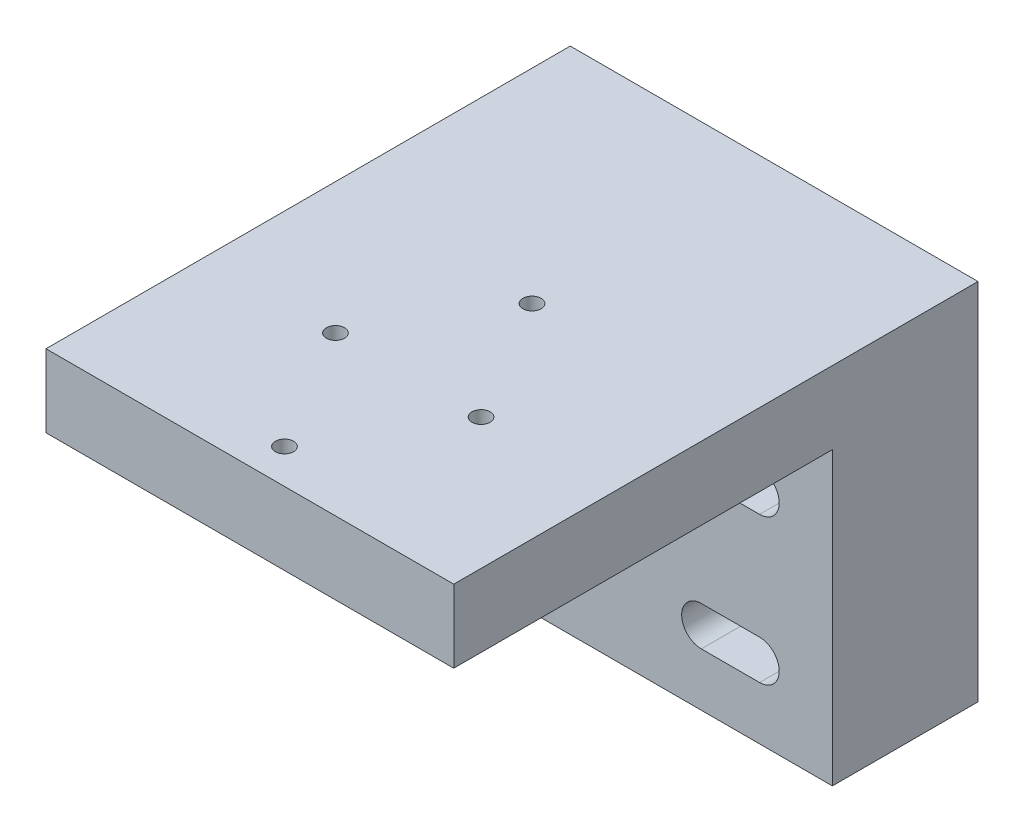
ISO-10303-21;
HEADER;
FILE_DESCRIPTION(('STEP AP214'),'2;1');
FILE_NAME('part.step','',(''),(''),'','','');
FILE_SCHEMA(('AUTOMOTIVE_DESIGN { 1 0 10303 214 1 1 1 1 }'));
ENDSEC;
DATA;
#1=APPLICATION_CONTEXT('core data for automotive mechanical design processes');
#2=APPLICATION_PROTOCOL_DEFINITION('international standard','automotive_design',2000,#1);
#3=PRODUCT_CONTEXT('',#1,'mechanical');
#4=PRODUCT('Part','Part','',(#3));
#5=PRODUCT_RELATED_PRODUCT_CATEGORY('part','',(#4));
#6=PRODUCT_DEFINITION_FORMATION('','',#4);
#7=PRODUCT_DEFINITION_CONTEXT('part definition',#1,'design');
#8=PRODUCT_DEFINITION('design','',#6,#7);
#9=PRODUCT_DEFINITION_SHAPE('','',#8);
#10=(LENGTH_UNIT() NAMED_UNIT(*) SI_UNIT(.MILLI.,.METRE.));
#11=(NAMED_UNIT(*) PLANE_ANGLE_UNIT() SI_UNIT($,.RADIAN.));
#12=(NAMED_UNIT(*) SI_UNIT($,.STERADIAN.) SOLID_ANGLE_UNIT());
#13=UNCERTAINTY_MEASURE_WITH_UNIT(LENGTH_MEASURE(1.E-05),#10,'distance_accuracy_value','');
#14=(GEOMETRIC_REPRESENTATION_CONTEXT(3) GLOBAL_UNCERTAINTY_ASSIGNED_CONTEXT((#13)) GLOBAL_UNIT_ASSIGNED_CONTEXT((#10,
#11,#12)) REPRESENTATION_CONTEXT('',''));
#15=CARTESIAN_POINT('',(0.,0.,0.));
#16=DIRECTION('',(0.,0.,1.));
#17=DIRECTION('',(1.,0.,0.));
#18=AXIS2_PLACEMENT_3D('',#15,#16,#17);
#19=CARTESIAN_POINT('',(0.,0.,72.));
#20=DIRECTION('',(1.,0.,0.));
#21=DIRECTION('',(0.,0.,-1.));
#22=AXIS2_PLACEMENT_3D('',#19,#20,#21);
#23=PLANE('',#22);
#24=DIRECTION('',(0.,1.,0.));
#25=VECTOR('',#24,1.);
#26=CARTESIAN_POINT('',(0.,0.,20.));
#27=LINE('',#26,#25);
#28=CARTESIAN_POINT('',(0.,0.,20.));
#29=VERTEX_POINT('',#28);
#30=CARTESIAN_POINT('',(0.,40.,20.));
#31=VERTEX_POINT('',#30);
#32=EDGE_CURVE('E351',#29,#31,#27,.T.);
#33=ORIENTED_EDGE('',*,*,#32,.T.);
#34=DIRECTION('',(0.,0.,1.));
#35=VECTOR('',#34,1.);
#36=CARTESIAN_POINT('',(0.,40.,72.));
#37=LINE('',#36,#35);
#38=CARTESIAN_POINT('',(0.,40.,72.));
#39=VERTEX_POINT('',#38);
#40=EDGE_CURVE('E354',#31,#39,#37,.T.);
#41=ORIENTED_EDGE('',*,*,#40,.T.);
#42=DIRECTION('',(0.,-1.,0.));
#43=VECTOR('',#42,1.);
#44=CARTESIAN_POINT('',(0.,0.,72.));
#45=LINE('',#44,#43);
#46=CARTESIAN_POINT('',(0.,50.,72.));
#47=VERTEX_POINT('',#46);
#48=EDGE_CURVE('E369',#47,#39,#45,.T.);
#49=ORIENTED_EDGE('',*,*,#48,.F.);
#50=DIRECTION('',(0.,0.,-1.));
#51=VECTOR('',#50,1.);
#52=CARTESIAN_POINT('',(0.,50.,72.));
#53=LINE('',#52,#51);
#54=CARTESIAN_POINT('',(0.,50.,0.));
#55=VERTEX_POINT('',#54);
#56=EDGE_CURVE('E377',#47,#55,#53,.T.);
#57=ORIENTED_EDGE('',*,*,#56,.T.);
#58=DIRECTION('',(0.,-1.,0.));
#59=VECTOR('',#58,1.);
#60=CARTESIAN_POINT('',(0.,0.,0.));
#61=LINE('',#60,#59);
#62=CARTESIAN_POINT('',(0.,0.,0.));
#63=VERTEX_POINT('',#62);
#64=EDGE_CURVE('E365',#55,#63,#61,.T.);
#65=ORIENTED_EDGE('',*,*,#64,.T.);
#66=DIRECTION('',(0.,0.,-1.));
#67=VECTOR('',#66,1.);
#68=CARTESIAN_POINT('',(0.,0.,72.));
#69=LINE('',#68,#67);
#70=EDGE_CURVE('E11',#29,#63,#69,.T.);
#71=ORIENTED_EDGE('',*,*,#70,.F.);
#72=EDGE_LOOP('',(#33,#41,#49,#57,#65,#71));
#73=FACE_BOUND('',#72,.T.);
#74=ADVANCED_FACE('F35',(#73),#23,.F.);
#75=CARTESIAN_POINT('',(0.,0.,72.));
#76=DIRECTION('',(0.,1.,0.));
#77=DIRECTION('',(0.,0.,1.));
#78=AXIS2_PLACEMENT_3D('',#75,#76,#77);
#79=PLANE('',#78);
#80=DIRECTION('',(0.,0.,-1.));
#81=VECTOR('',#80,1.);
#82=CARTESIAN_POINT('',(56.,0.,72.));
#83=LINE('',#82,#81);
#84=CARTESIAN_POINT('',(56.,0.,20.));
#85=VERTEX_POINT('',#84);
#86=CARTESIAN_POINT('',(56.,0.,0.));
#87=VERTEX_POINT('',#86);
#88=EDGE_CURVE('E42',#85,#87,#83,.T.);
#89=ORIENTED_EDGE('',*,*,#88,.F.);
#90=DIRECTION('',(1.,0.,0.));
#91=VECTOR('',#90,1.);
#92=CARTESIAN_POINT('',(0.,0.,20.));
#93=LINE('',#92,#91);
#94=EDGE_CURVE('E358',#29,#85,#93,.T.);
#95=ORIENTED_EDGE('',*,*,#94,.F.);
#96=ORIENTED_EDGE('',*,*,#70,.T.);
#97=DIRECTION('',(1.,0.,0.));
#98=VECTOR('',#97,1.);
#99=CARTESIAN_POINT('',(0.,0.,0.));
#100=LINE('',#99,#98);
#101=EDGE_CURVE('E380',#63,#87,#100,.T.);
#102=ORIENTED_EDGE('',*,*,#101,.T.);
#103=EDGE_LOOP('',(#89,#95,#96,#102));
#104=FACE_BOUND('',#103,.T.);
#105=ADVANCED_FACE('F401',(#104),#79,.F.);
#106=CARTESIAN_POINT('',(56.,0.,72.));
#107=DIRECTION('',(-1.,0.,0.));
#108=DIRECTION('',(0.,0.,1.));
#109=AXIS2_PLACEMENT_3D('',#106,#107,#108);
#110=PLANE('',#109);
#111=DIRECTION('',(0.,1.,0.));
#112=VECTOR('',#111,1.);
#113=CARTESIAN_POINT('',(56.,0.,72.));
#114=LINE('',#113,#112);
#115=CARTESIAN_POINT('',(56.,40.,72.));
#116=VERTEX_POINT('',#115);
#117=CARTESIAN_POINT('',(56.,50.,72.));
#118=VERTEX_POINT('',#117);
#119=EDGE_CURVE('E372',#116,#118,#114,.T.);
#120=ORIENTED_EDGE('',*,*,#119,.F.);
#121=DIRECTION('',(0.,0.,1.));
#122=VECTOR('',#121,1.);
#123=CARTESIAN_POINT('',(56.,40.,72.));
#124=LINE('',#123,#122);
#125=CARTESIAN_POINT('',(56.,40.,20.));
#126=VERTEX_POINT('',#125);
#127=EDGE_CURVE('E355',#126,#116,#124,.T.);
#128=ORIENTED_EDGE('',*,*,#127,.F.);
#129=DIRECTION('',(0.,1.,0.));
#130=VECTOR('',#129,1.);
#131=CARTESIAN_POINT('',(56.,0.,20.));
#132=LINE('',#131,#130);
#133=EDGE_CURVE('E350',#85,#126,#132,.T.);
#134=ORIENTED_EDGE('',*,*,#133,.F.);
#135=ORIENTED_EDGE('',*,*,#88,.T.);
#136=DIRECTION('',(0.,1.,0.));
#137=VECTOR('',#136,1.);
#138=CARTESIAN_POINT('',(56.,0.,0.));
#139=LINE('',#138,#137);
#140=CARTESIAN_POINT('',(56.,50.,0.));
#141=VERTEX_POINT('',#140);
#142=EDGE_CURVE('E383',#87,#141,#139,.T.);
#143=ORIENTED_EDGE('',*,*,#142,.T.);
#144=DIRECTION('',(0.,0.,-1.));
#145=VECTOR('',#144,1.);
#146=CARTESIAN_POINT('',(56.,50.,72.));
#147=LINE('',#146,#145);
#148=EDGE_CURVE('E388',#118,#141,#147,.T.);
#149=ORIENTED_EDGE('',*,*,#148,.F.);
#150=EDGE_LOOP('',(#120,#128,#134,#135,#143,#149));
#151=FACE_BOUND('',#150,.T.);
#152=ADVANCED_FACE('F394',(#151),#110,.F.);
#153=CARTESIAN_POINT('',(0.,50.,72.));
#154=DIRECTION('',(0.,-1.,0.));
#155=DIRECTION('',(0.,0.,-1.));
#156=AXIS2_PLACEMENT_3D('',#153,#154,#155);
#157=PLANE('',#156);
#158=CARTESIAN_POINT('',(28.,50.,67.25));
#159=DIRECTION('',(0.,1.,0.));
#160=DIRECTION('',(0.,0.,1.));
#161=AXIS2_PLACEMENT_3D('',#158,#159,#160);
#162=CIRCLE('',#161,1.25);
#163=CARTESIAN_POINT('',(28.,50.,68.5));
#164=VERTEX_POINT('',#163);
#165=EDGE_CURVE('E320',#164,#164,#162,.T.);
#166=ORIENTED_EDGE('',*,*,#165,.F.);
#167=EDGE_LOOP('',(#166));
#168=FACE_BOUND('',#167,.T.);
#169=CARTESIAN_POINT('',(28.,50.,33.25));
#170=DIRECTION('',(0.,1.,0.));
#171=DIRECTION('',(0.,0.,1.));
#172=AXIS2_PLACEMENT_3D('',#169,#170,#171);
#173=CIRCLE('',#172,1.25);
#174=CARTESIAN_POINT('',(28.,50.,34.5));
#175=VERTEX_POINT('',#174);
#176=EDGE_CURVE('E332',#175,#175,#173,.T.);
#177=ORIENTED_EDGE('',*,*,#176,.F.);
#178=EDGE_LOOP('',(#177));
#179=FACE_BOUND('',#178,.T.);
#180=CARTESIAN_POINT('',(18.,50.,50.25));
#181=DIRECTION('',(0.,1.,0.));
#182=DIRECTION('',(0.,0.,1.));
#183=AXIS2_PLACEMENT_3D('',#180,#181,#182);
#184=CIRCLE('',#183,1.25);
#185=CARTESIAN_POINT('',(18.,50.,51.5));
#186=VERTEX_POINT('',#185);
#187=EDGE_CURVE('E338',#186,#186,#184,.T.);
#188=ORIENTED_EDGE('',*,*,#187,.F.);
#189=EDGE_LOOP('',(#188));
#190=FACE_BOUND('',#189,.T.);
#191=CARTESIAN_POINT('',(38.,50.,50.25));
#192=DIRECTION('',(0.,1.,0.));
#193=DIRECTION('',(0.,0.,1.));
#194=AXIS2_PLACEMENT_3D('',#191,#192,#193);
#195=CIRCLE('',#194,1.25);
#196=CARTESIAN_POINT('',(38.,50.,51.5));
#197=VERTEX_POINT('',#196);
#198=EDGE_CURVE('E344',#197,#197,#195,.T.);
#199=ORIENTED_EDGE('',*,*,#198,.F.);
#200=EDGE_LOOP('',(#199));
#201=FACE_BOUND('',#200,.T.);
#202=DIRECTION('',(-1.,0.,0.));
#203=VECTOR('',#202,1.);
#204=CARTESIAN_POINT('',(0.,50.,0.));
#205=LINE('',#204,#203);
#206=EDGE_CURVE('E373',#141,#55,#205,.T.);
#207=ORIENTED_EDGE('',*,*,#206,.T.);
#208=ORIENTED_EDGE('',*,*,#56,.F.);
#209=DIRECTION('',(-1.,0.,0.));
#210=VECTOR('',#209,1.);
#211=CARTESIAN_POINT('',(0.,50.,72.));
#212=LINE('',#211,#210);
#213=EDGE_CURVE('E375',#118,#47,#212,.T.);
#214=ORIENTED_EDGE('',*,*,#213,.F.);
#215=ORIENTED_EDGE('',*,*,#148,.T.);
#216=EDGE_LOOP('',(#207,#208,#214,#215));
#217=FACE_BOUND('',#216,.T.);
#218=ADVANCED_FACE('F408',(#168,#179,#190,#201,#217),#157,.F.);
#219=CARTESIAN_POINT('',(0.,50.,72.));
#220=DIRECTION('',(0.,0.,-1.));
#221=DIRECTION('',(-1.,0.,0.));
#222=AXIS2_PLACEMENT_3D('',#219,#220,#221);
#223=PLANE('',#222);
#224=ORIENTED_EDGE('',*,*,#48,.T.);
#225=DIRECTION('',(1.,0.,0.));
#226=VECTOR('',#225,1.);
#227=CARTESIAN_POINT('',(0.,40.,72.));
#228=LINE('',#227,#226);
#229=EDGE_CURVE('E362',#39,#116,#228,.T.);
#230=ORIENTED_EDGE('',*,*,#229,.T.);
#231=ORIENTED_EDGE('',*,*,#119,.T.);
#232=ORIENTED_EDGE('',*,*,#213,.T.);
#233=EDGE_LOOP('',(#224,#230,#231,#232));
#234=FACE_BOUND('',#233,.T.);
#235=ADVANCED_FACE('F414',(#234),#223,.F.);
#236=CARTESIAN_POINT('',(0.,50.,0.));
#237=DIRECTION('',(0.,0.,-1.));
#238=DIRECTION('',(-1.,0.,0.));
#239=AXIS2_PLACEMENT_3D('',#236,#237,#238);
#240=PLANE('',#239);
#241=CARTESIAN_POINT('',(46.,10.,0.));
#242=DIRECTION('',(0.,0.,1.));
#243=DIRECTION('',(1.,0.,0.));
#244=AXIS2_PLACEMENT_3D('',#241,#242,#243);
#245=CIRCLE('',#244,2.70000000000001);
#246=CARTESIAN_POINT('',(46.,7.29999999999999,0.));
#247=VERTEX_POINT('',#246);
#248=CARTESIAN_POINT('',(46.,12.7,0.));
#249=VERTEX_POINT('',#248);
#250=EDGE_CURVE('E196',#247,#249,#245,.T.);
#251=ORIENTED_EDGE('',*,*,#250,.T.);
#252=DIRECTION('',(-1.,0.,0.));
#253=VECTOR('',#252,1.);
#254=CARTESIAN_POINT('',(46.,12.7,0.));
#255=LINE('',#254,#253);
#256=CARTESIAN_POINT('',(38.,12.7,0.));
#257=VERTEX_POINT('',#256);
#258=EDGE_CURVE('E205',#249,#257,#255,.T.);
#259=ORIENTED_EDGE('',*,*,#258,.T.);
#260=CARTESIAN_POINT('',(38.,10.,0.));
#261=DIRECTION('',(0.,0.,1.));
#262=DIRECTION('',(1.,0.,0.));
#263=AXIS2_PLACEMENT_3D('',#260,#261,#262);
#264=CIRCLE('',#263,2.7);
#265=CARTESIAN_POINT('',(38.,7.30000000000001,0.));
#266=VERTEX_POINT('',#265);
#267=EDGE_CURVE('E49',#257,#266,#264,.T.);
#268=ORIENTED_EDGE('',*,*,#267,.T.);
#269=DIRECTION('',(1.,0.,0.));
#270=VECTOR('',#269,1.);
#271=CARTESIAN_POINT('',(46.,7.29999999999999,0.));
#272=LINE('',#271,#270);
#273=EDGE_CURVE('E202',#266,#247,#272,.T.);
#274=ORIENTED_EDGE('',*,*,#273,.T.);
#275=EDGE_LOOP('',(#251,#259,#268,#274));
#276=FACE_BOUND('',#275,.T.);
#277=CARTESIAN_POINT('',(10.,10.,0.));
#278=DIRECTION('',(0.,0.,1.));
#279=DIRECTION('',(-1.,0.,0.));
#280=AXIS2_PLACEMENT_3D('',#277,#278,#279);
#281=CIRCLE('',#280,2.70000000000001);
#282=CARTESIAN_POINT('',(10.,12.7,0.));
#283=VERTEX_POINT('',#282);
#284=CARTESIAN_POINT('',(10.,7.29999999999999,0.));
#285=VERTEX_POINT('',#284);
#286=EDGE_CURVE('E231',#283,#285,#281,.T.);
#287=ORIENTED_EDGE('',*,*,#286,.T.);
#288=DIRECTION('',(1.,0.,0.));
#289=VECTOR('',#288,1.);
#290=CARTESIAN_POINT('',(10.,7.29999999999999,0.));
#291=LINE('',#290,#289);
#292=CARTESIAN_POINT('',(18.,7.30000000000001,0.));
#293=VERTEX_POINT('',#292);
#294=EDGE_CURVE('E234',#285,#293,#291,.T.);
#295=ORIENTED_EDGE('',*,*,#294,.T.);
#296=CARTESIAN_POINT('',(18.,10.,0.));
#297=DIRECTION('',(0.,0.,1.));
#298=DIRECTION('',(-1.,0.,0.));
#299=AXIS2_PLACEMENT_3D('',#296,#297,#298);
#300=CIRCLE('',#299,2.7);
#301=CARTESIAN_POINT('',(18.,12.7,0.));
#302=VERTEX_POINT('',#301);
#303=EDGE_CURVE('E238',#293,#302,#300,.T.);
#304=ORIENTED_EDGE('',*,*,#303,.T.);
#305=DIRECTION('',(-1.,0.,0.));
#306=VECTOR('',#305,1.);
#307=CARTESIAN_POINT('',(10.,12.7,0.));
#308=LINE('',#307,#306);
#309=EDGE_CURVE('E241',#302,#283,#308,.T.);
#310=ORIENTED_EDGE('',*,*,#309,.T.);
#311=EDGE_LOOP('',(#287,#295,#304,#310));
#312=FACE_BOUND('',#311,.T.);
#313=CARTESIAN_POINT('',(46.,30.,0.));
#314=DIRECTION('',(0.,0.,1.));
#315=DIRECTION('',(-1.,0.,0.));
#316=AXIS2_PLACEMENT_3D('',#313,#314,#315);
#317=CIRCLE('',#316,2.70000000000001);
#318=CARTESIAN_POINT('',(46.,27.3,0.));
#319=VERTEX_POINT('',#318);
#320=CARTESIAN_POINT('',(46.,32.7,0.));
#321=VERTEX_POINT('',#320);
#322=EDGE_CURVE('E263',#319,#321,#317,.T.);
#323=ORIENTED_EDGE('',*,*,#322,.T.);
#324=DIRECTION('',(-1.,0.,0.));
#325=VECTOR('',#324,1.);
#326=CARTESIAN_POINT('',(46.,32.7,0.));
#327=LINE('',#326,#325);
#328=CARTESIAN_POINT('',(38.,32.7,0.));
#329=VERTEX_POINT('',#328);
#330=EDGE_CURVE('E266',#321,#329,#327,.T.);
#331=ORIENTED_EDGE('',*,*,#330,.T.);
#332=CARTESIAN_POINT('',(38.,30.,0.));
#333=DIRECTION('',(0.,0.,1.));
#334=DIRECTION('',(-1.,0.,0.));
#335=AXIS2_PLACEMENT_3D('',#332,#333,#334);
#336=CIRCLE('',#335,2.7);
#337=CARTESIAN_POINT('',(38.,27.3,0.));
#338=VERTEX_POINT('',#337);
#339=EDGE_CURVE('E270',#329,#338,#336,.T.);
#340=ORIENTED_EDGE('',*,*,#339,.T.);
#341=DIRECTION('',(1.,0.,0.));
#342=VECTOR('',#341,1.);
#343=CARTESIAN_POINT('',(46.,27.3,0.));
#344=LINE('',#343,#342);
#345=EDGE_CURVE('E273',#338,#319,#344,.T.);
#346=ORIENTED_EDGE('',*,*,#345,.T.);
#347=EDGE_LOOP('',(#323,#331,#340,#346));
#348=FACE_BOUND('',#347,.T.);
#349=CARTESIAN_POINT('',(10.,30.,0.));
#350=DIRECTION('',(0.,0.,1.));
#351=DIRECTION('',(1.,0.,0.));
#352=AXIS2_PLACEMENT_3D('',#349,#350,#351);
#353=CIRCLE('',#352,2.70000000000001);
#354=CARTESIAN_POINT('',(10.,32.7,0.));
#355=VERTEX_POINT('',#354);
#356=CARTESIAN_POINT('',(10.,27.3,0.));
#357=VERTEX_POINT('',#356);
#358=EDGE_CURVE('E295',#355,#357,#353,.T.);
#359=ORIENTED_EDGE('',*,*,#358,.T.);
#360=DIRECTION('',(1.,0.,0.));
#361=VECTOR('',#360,1.);
#362=CARTESIAN_POINT('',(10.,27.3,0.));
#363=LINE('',#362,#361);
#364=CARTESIAN_POINT('',(18.,27.3,0.));
#365=VERTEX_POINT('',#364);
#366=EDGE_CURVE('E298',#357,#365,#363,.T.);
#367=ORIENTED_EDGE('',*,*,#366,.T.);
#368=CARTESIAN_POINT('',(18.,30.,0.));
#369=DIRECTION('',(0.,0.,1.));
#370=DIRECTION('',(1.,0.,0.));
#371=AXIS2_PLACEMENT_3D('',#368,#369,#370);
#372=CIRCLE('',#371,2.7);
#373=CARTESIAN_POINT('',(18.,32.7,0.));
#374=VERTEX_POINT('',#373);
#375=EDGE_CURVE('E302',#365,#374,#372,.T.);
#376=ORIENTED_EDGE('',*,*,#375,.T.);
#377=DIRECTION('',(-1.,0.,0.));
#378=VECTOR('',#377,1.);
#379=CARTESIAN_POINT('',(10.,32.7,0.));
#380=LINE('',#379,#378);
#381=EDGE_CURVE('E305',#374,#355,#380,.T.);
#382=ORIENTED_EDGE('',*,*,#381,.T.);
#383=EDGE_LOOP('',(#359,#367,#376,#382));
#384=FACE_BOUND('',#383,.T.);
#385=ORIENTED_EDGE('',*,*,#64,.F.);
#386=ORIENTED_EDGE('',*,*,#206,.F.);
#387=ORIENTED_EDGE('',*,*,#142,.F.);
#388=ORIENTED_EDGE('',*,*,#101,.F.);
#389=EDGE_LOOP('',(#385,#386,#387,#388));
#390=FACE_BOUND('',#389,.T.);
#391=ADVANCED_FACE('F209',(#276,#312,#348,#384,#390),#240,.T.);
#392=CARTESIAN_POINT('',(0.,40.,72.));
#393=DIRECTION('',(0.,1.,0.));
#394=DIRECTION('',(0.,0.,1.));
#395=AXIS2_PLACEMENT_3D('',#392,#393,#394);
#396=PLANE('',#395);
#397=ORIENTED_EDGE('',*,*,#127,.T.);
#398=ORIENTED_EDGE('',*,*,#229,.F.);
#399=ORIENTED_EDGE('',*,*,#40,.F.);
#400=DIRECTION('',(1.,0.,0.));
#401=VECTOR('',#400,1.);
#402=CARTESIAN_POINT('',(0.,40.,20.));
#403=LINE('',#402,#401);
#404=EDGE_CURVE('E366',#31,#126,#403,.T.);
#405=ORIENTED_EDGE('',*,*,#404,.T.);
#406=EDGE_LOOP('',(#397,#398,#399,#405));
#407=FACE_BOUND('',#406,.T.);
#408=ADVANCED_FACE('F416',(#407),#396,.F.);
#409=CARTESIAN_POINT('',(0.,0.,20.));
#410=DIRECTION('',(0.,0.,-1.));
#411=DIRECTION('',(-1.,0.,0.));
#412=AXIS2_PLACEMENT_3D('',#409,#410,#411);
#413=PLANE('',#412);
#414=DIRECTION('',(-1.,0.,0.));
#415=VECTOR('',#414,1.);
#416=CARTESIAN_POINT('',(46.,12.7,20.));
#417=LINE('',#416,#415);
#418=CARTESIAN_POINT('',(46.,12.7,20.));
#419=VERTEX_POINT('',#418);
#420=CARTESIAN_POINT('',(38.,12.7,20.));
#421=VERTEX_POINT('',#420);
#422=EDGE_CURVE('E221',#419,#421,#417,.T.);
#423=ORIENTED_EDGE('',*,*,#422,.F.);
#424=CARTESIAN_POINT('',(46.,10.,20.));
#425=DIRECTION('',(0.,0.,1.));
#426=DIRECTION('',(1.,0.,0.));
#427=AXIS2_PLACEMENT_3D('',#424,#425,#426);
#428=CIRCLE('',#427,2.70000000000001);
#429=CARTESIAN_POINT('',(46.,7.29999999999999,20.));
#430=VERTEX_POINT('',#429);
#431=EDGE_CURVE('E57',#430,#419,#428,.T.);
#432=ORIENTED_EDGE('',*,*,#431,.F.);
#433=DIRECTION('',(1.,0.,0.));
#434=VECTOR('',#433,1.);
#435=CARTESIAN_POINT('',(46.,7.29999999999999,20.));
#436=LINE('',#435,#434);
#437=CARTESIAN_POINT('',(38.,7.30000000000001,20.));
#438=VERTEX_POINT('',#437);
#439=EDGE_CURVE('E212',#438,#430,#436,.T.);
#440=ORIENTED_EDGE('',*,*,#439,.F.);
#441=CARTESIAN_POINT('',(38.,10.,20.));
#442=DIRECTION('',(0.,0.,1.));
#443=DIRECTION('',(1.,0.,0.));
#444=AXIS2_PLACEMENT_3D('',#441,#442,#443);
#445=CIRCLE('',#444,2.7);
#446=EDGE_CURVE('E215',#421,#438,#445,.T.);
#447=ORIENTED_EDGE('',*,*,#446,.F.);
#448=EDGE_LOOP('',(#423,#432,#440,#447));
#449=FACE_BOUND('',#448,.T.);
#450=DIRECTION('',(1.,0.,0.));
#451=VECTOR('',#450,1.);
#452=CARTESIAN_POINT('',(10.,7.29999999999999,20.));
#453=LINE('',#452,#451);
#454=CARTESIAN_POINT('',(10.,7.29999999999999,20.));
#455=VERTEX_POINT('',#454);
#456=CARTESIAN_POINT('',(18.,7.30000000000001,20.));
#457=VERTEX_POINT('',#456);
#458=EDGE_CURVE('E246',#455,#457,#453,.T.);
#459=ORIENTED_EDGE('',*,*,#458,.F.);
#460=CARTESIAN_POINT('',(10.,10.,20.));
#461=DIRECTION('',(0.,0.,1.));
#462=DIRECTION('',(-1.,0.,0.));
#463=AXIS2_PLACEMENT_3D('',#460,#461,#462);
#464=CIRCLE('',#463,2.70000000000001);
#465=CARTESIAN_POINT('',(10.,12.7,20.));
#466=VERTEX_POINT('',#465);
#467=EDGE_CURVE('E227',#466,#455,#464,.T.);
#468=ORIENTED_EDGE('',*,*,#467,.F.);
#469=DIRECTION('',(-1.,0.,0.));
#470=VECTOR('',#469,1.);
#471=CARTESIAN_POINT('',(10.,12.7,20.));
#472=LINE('',#471,#470);
#473=CARTESIAN_POINT('',(18.,12.7,20.));
#474=VERTEX_POINT('',#473);
#475=EDGE_CURVE('E235',#474,#466,#472,.T.);
#476=ORIENTED_EDGE('',*,*,#475,.F.);
#477=CARTESIAN_POINT('',(18.,10.,20.));
#478=DIRECTION('',(0.,0.,1.));
#479=DIRECTION('',(-1.,0.,0.));
#480=AXIS2_PLACEMENT_3D('',#477,#478,#479);
#481=CIRCLE('',#480,2.7);
#482=EDGE_CURVE('E249',#457,#474,#481,.T.);
#483=ORIENTED_EDGE('',*,*,#482,.F.);
#484=EDGE_LOOP('',(#459,#468,#476,#483));
#485=FACE_BOUND('',#484,.T.);
#486=DIRECTION('',(-1.,0.,0.));
#487=VECTOR('',#486,1.);
#488=CARTESIAN_POINT('',(46.,32.7,20.));
#489=LINE('',#488,#487);
#490=CARTESIAN_POINT('',(46.,32.7,20.));
#491=VERTEX_POINT('',#490);
#492=CARTESIAN_POINT('',(38.,32.7,20.));
#493=VERTEX_POINT('',#492);
#494=EDGE_CURVE('E278',#491,#493,#489,.T.);
#495=ORIENTED_EDGE('',*,*,#494,.F.);
#496=CARTESIAN_POINT('',(46.,30.,20.));
#497=DIRECTION('',(0.,0.,1.));
#498=DIRECTION('',(-1.,0.,0.));
#499=AXIS2_PLACEMENT_3D('',#496,#497,#498);
#500=CIRCLE('',#499,2.70000000000001);
#501=CARTESIAN_POINT('',(46.,27.3,20.));
#502=VERTEX_POINT('',#501);
#503=EDGE_CURVE('E256',#502,#491,#500,.T.);
#504=ORIENTED_EDGE('',*,*,#503,.F.);
#505=DIRECTION('',(1.,0.,0.));
#506=VECTOR('',#505,1.);
#507=CARTESIAN_POINT('',(46.,27.3,20.));
#508=LINE('',#507,#506);
#509=CARTESIAN_POINT('',(38.,27.3,20.));
#510=VERTEX_POINT('',#509);
#511=EDGE_CURVE('E267',#510,#502,#508,.T.);
#512=ORIENTED_EDGE('',*,*,#511,.F.);
#513=CARTESIAN_POINT('',(38.,30.,20.));
#514=DIRECTION('',(0.,0.,1.));
#515=DIRECTION('',(-1.,0.,0.));
#516=AXIS2_PLACEMENT_3D('',#513,#514,#515);
#517=CIRCLE('',#516,2.7);
#518=EDGE_CURVE('E281',#493,#510,#517,.T.);
#519=ORIENTED_EDGE('',*,*,#518,.F.);
#520=EDGE_LOOP('',(#495,#504,#512,#519));
#521=FACE_BOUND('',#520,.T.);
#522=DIRECTION('',(1.,0.,0.));
#523=VECTOR('',#522,1.);
#524=CARTESIAN_POINT('',(10.,27.3,20.));
#525=LINE('',#524,#523);
#526=CARTESIAN_POINT('',(10.,27.3,20.));
#527=VERTEX_POINT('',#526);
#528=CARTESIAN_POINT('',(18.,27.3,20.));
#529=VERTEX_POINT('',#528);
#530=EDGE_CURVE('E310',#527,#529,#525,.T.);
#531=ORIENTED_EDGE('',*,*,#530,.F.);
#532=CARTESIAN_POINT('',(10.,30.,20.));
#533=DIRECTION('',(0.,0.,1.));
#534=DIRECTION('',(1.,0.,0.));
#535=AXIS2_PLACEMENT_3D('',#532,#533,#534);
#536=CIRCLE('',#535,2.70000000000001);
#537=CARTESIAN_POINT('',(10.,32.7,20.));
#538=VERTEX_POINT('',#537);
#539=EDGE_CURVE('E288',#538,#527,#536,.T.);
#540=ORIENTED_EDGE('',*,*,#539,.F.);
#541=DIRECTION('',(-1.,0.,0.));
#542=VECTOR('',#541,1.);
#543=CARTESIAN_POINT('',(10.,32.7,20.));
#544=LINE('',#543,#542);
#545=CARTESIAN_POINT('',(18.,32.7,20.));
#546=VERTEX_POINT('',#545);
#547=EDGE_CURVE('E299',#546,#538,#544,.T.);
#548=ORIENTED_EDGE('',*,*,#547,.F.);
#549=CARTESIAN_POINT('',(18.,30.,20.));
#550=DIRECTION('',(0.,0.,1.));
#551=DIRECTION('',(1.,0.,0.));
#552=AXIS2_PLACEMENT_3D('',#549,#550,#551);
#553=CIRCLE('',#552,2.7);
#554=EDGE_CURVE('E313',#529,#546,#553,.T.);
#555=ORIENTED_EDGE('',*,*,#554,.F.);
#556=EDGE_LOOP('',(#531,#540,#548,#555));
#557=FACE_BOUND('',#556,.T.);
#558=ORIENTED_EDGE('',*,*,#133,.T.);
#559=ORIENTED_EDGE('',*,*,#404,.F.);
#560=ORIENTED_EDGE('',*,*,#32,.F.);
#561=ORIENTED_EDGE('',*,*,#94,.T.);
#562=EDGE_LOOP('',(#558,#559,#560,#561));
#563=FACE_BOUND('',#562,.T.);
#564=ADVANCED_FACE('F418',(#449,#485,#521,#557,#563),#413,.F.);
#565=CARTESIAN_POINT('',(38.,42.5,50.25));
#566=DIRECTION('',(0.,1.,0.));
#567=DIRECTION('',(0.,0.,1.));
#568=AXIS2_PLACEMENT_3D('',#565,#566,#567);
#569=CONICAL_SURFACE('',#568,1.24999999999999,1.02974425867665);
#570=CARTESIAN_POINT('',(38.,41.7489242262155,50.25));
#571=VERTEX_POINT('',#570);
#572=VERTEX_LOOP('',#571);
#573=FACE_BOUND('',#572,.T.);
#574=CARTESIAN_POINT('',(38.,42.5,50.25));
#575=DIRECTION('',(0.,1.,0.));
#576=DIRECTION('',(0.,0.,1.));
#577=AXIS2_PLACEMENT_3D('',#574,#575,#576);
#578=CIRCLE('',#577,1.24999999999999);
#579=CARTESIAN_POINT('',(38.,42.5,51.5));
#580=VERTEX_POINT('',#579);
#581=EDGE_CURVE('E347',#580,#580,#578,.T.);
#582=ORIENTED_EDGE('',*,*,#581,.T.);
#583=EDGE_LOOP('',(#582));
#584=FACE_BOUND('',#583,.T.);
#585=ADVANCED_FACE('F420',(#573,#584),#569,.F.);
#586=CARTESIAN_POINT('',(38.,50.,50.25));
#587=DIRECTION('',(0.,1.,0.));
#588=DIRECTION('',(0.,0.,1.));
#589=AXIS2_PLACEMENT_3D('',#586,#587,#588);
#590=CYLINDRICAL_SURFACE('',#589,1.25);
#591=ORIENTED_EDGE('',*,*,#581,.F.);
#592=EDGE_LOOP('',(#591));
#593=FACE_BOUND('',#592,.T.);
#594=ORIENTED_EDGE('',*,*,#198,.T.);
#595=EDGE_LOOP('',(#594));
#596=FACE_BOUND('',#595,.T.);
#597=ADVANCED_FACE('F428',(#593,#596),#590,.F.);
#598=CARTESIAN_POINT('',(18.,42.5,50.25));
#599=DIRECTION('',(0.,1.,0.));
#600=DIRECTION('',(0.,0.,1.));
#601=AXIS2_PLACEMENT_3D('',#598,#599,#600);
#602=CONICAL_SURFACE('',#601,1.25,1.02974425867665);
#603=CARTESIAN_POINT('',(18.,41.7489242262155,50.25));
#604=VERTEX_POINT('',#603);
#605=VERTEX_LOOP('',#604);
#606=FACE_BOUND('',#605,.T.);
#607=CARTESIAN_POINT('',(18.,42.5,50.25));
#608=DIRECTION('',(0.,1.,0.));
#609=DIRECTION('',(0.,0.,1.));
#610=AXIS2_PLACEMENT_3D('',#607,#608,#609);
#611=CIRCLE('',#610,1.25);
#612=CARTESIAN_POINT('',(18.,42.5,51.5));
#613=VERTEX_POINT('',#612);
#614=EDGE_CURVE('E341',#613,#613,#611,.T.);
#615=ORIENTED_EDGE('',*,*,#614,.T.);
#616=EDGE_LOOP('',(#615));
#617=FACE_BOUND('',#616,.T.);
#618=ADVANCED_FACE('F480',(#606,#617),#602,.F.);
#619=CARTESIAN_POINT('',(18.,50.,50.25));
#620=DIRECTION('',(0.,1.,0.));
#621=DIRECTION('',(0.,0.,1.));
#622=AXIS2_PLACEMENT_3D('',#619,#620,#621);
#623=CYLINDRICAL_SURFACE('',#622,1.25);
#624=ORIENTED_EDGE('',*,*,#614,.F.);
#625=EDGE_LOOP('',(#624));
#626=FACE_BOUND('',#625,.T.);
#627=ORIENTED_EDGE('',*,*,#187,.T.);
#628=EDGE_LOOP('',(#627));
#629=FACE_BOUND('',#628,.T.);
#630=ADVANCED_FACE('F488',(#626,#629),#623,.F.);
#631=CARTESIAN_POINT('',(28.,42.5,33.25));
#632=DIRECTION('',(0.,1.,0.));
#633=DIRECTION('',(0.,0.,1.));
#634=AXIS2_PLACEMENT_3D('',#631,#632,#633);
#635=CONICAL_SURFACE('',#634,1.25,1.02974425867665);
#636=CARTESIAN_POINT('',(28.,41.7489242262155,33.25));
#637=VERTEX_POINT('',#636);
#638=VERTEX_LOOP('',#637);
#639=FACE_BOUND('',#638,.T.);
#640=CARTESIAN_POINT('',(28.,42.5,33.25));
#641=DIRECTION('',(0.,1.,0.));
#642=DIRECTION('',(0.,0.,1.));
#643=AXIS2_PLACEMENT_3D('',#640,#641,#642);
#644=CIRCLE('',#643,1.25);
#645=CARTESIAN_POINT('',(28.,42.5,34.5));
#646=VERTEX_POINT('',#645);
#647=EDGE_CURVE('E335',#646,#646,#644,.T.);
#648=ORIENTED_EDGE('',*,*,#647,.T.);
#649=EDGE_LOOP('',(#648));
#650=FACE_BOUND('',#649,.T.);
#651=ADVANCED_FACE('F496',(#639,#650),#635,.F.);
#652=CARTESIAN_POINT('',(28.,50.,33.25));
#653=DIRECTION('',(0.,1.,0.));
#654=DIRECTION('',(0.,0.,1.));
#655=AXIS2_PLACEMENT_3D('',#652,#653,#654);
#656=CYLINDRICAL_SURFACE('',#655,1.25);
#657=ORIENTED_EDGE('',*,*,#647,.F.);
#658=EDGE_LOOP('',(#657));
#659=FACE_BOUND('',#658,.T.);
#660=ORIENTED_EDGE('',*,*,#176,.T.);
#661=EDGE_LOOP('',(#660));
#662=FACE_BOUND('',#661,.T.);
#663=ADVANCED_FACE('F504',(#659,#662),#656,.F.);
#664=CARTESIAN_POINT('',(28.,42.5,67.25));
#665=DIRECTION('',(0.,1.,0.));
#666=DIRECTION('',(0.,0.,1.));
#667=AXIS2_PLACEMENT_3D('',#664,#665,#666);
#668=CONICAL_SURFACE('',#667,1.25,1.02974425867665);
#669=CARTESIAN_POINT('',(28.,41.7489242262155,67.25));
#670=VERTEX_POINT('',#669);
#671=VERTEX_LOOP('',#670);
#672=FACE_BOUND('',#671,.T.);
#673=CARTESIAN_POINT('',(28.,42.5,67.25));
#674=DIRECTION('',(0.,1.,0.));
#675=DIRECTION('',(0.,0.,1.));
#676=AXIS2_PLACEMENT_3D('',#673,#674,#675);
#677=CIRCLE('',#676,1.25);
#678=CARTESIAN_POINT('',(28.,42.5,68.5));
#679=VERTEX_POINT('',#678);
#680=EDGE_CURVE('E329',#679,#679,#677,.T.);
#681=ORIENTED_EDGE('',*,*,#680,.T.);
#682=EDGE_LOOP('',(#681));
#683=FACE_BOUND('',#682,.T.);
#684=ADVANCED_FACE('F512',(#672,#683),#668,.F.);
#685=CARTESIAN_POINT('',(28.,50.,67.25));
#686=DIRECTION('',(0.,1.,0.));
#687=DIRECTION('',(0.,0.,1.));
#688=AXIS2_PLACEMENT_3D('',#685,#686,#687);
#689=CYLINDRICAL_SURFACE('',#688,1.25);
#690=ORIENTED_EDGE('',*,*,#680,.F.);
#691=EDGE_LOOP('',(#690));
#692=FACE_BOUND('',#691,.T.);
#693=ORIENTED_EDGE('',*,*,#165,.T.);
#694=EDGE_LOOP('',(#693));
#695=FACE_BOUND('',#694,.T.);
#696=ADVANCED_FACE('F520',(#692,#695),#689,.F.);
#697=CARTESIAN_POINT('',(10.,30.,0.));
#698=DIRECTION('',(0.,0.,1.));
#699=DIRECTION('',(1.,0.,0.));
#700=AXIS2_PLACEMENT_3D('',#697,#698,#699);
#701=CYLINDRICAL_SURFACE('',#700,2.70000000000001);
#702=ORIENTED_EDGE('',*,*,#539,.T.);
#703=DIRECTION('',(0.,0.,1.));
#704=VECTOR('',#703,1.);
#705=CARTESIAN_POINT('',(10.,27.3,0.));
#706=LINE('',#705,#704);
#707=EDGE_CURVE('E308',#357,#527,#706,.T.);
#708=ORIENTED_EDGE('',*,*,#707,.F.);
#709=ORIENTED_EDGE('',*,*,#358,.F.);
#710=DIRECTION('',(0.,0.,1.));
#711=VECTOR('',#710,1.);
#712=CARTESIAN_POINT('',(10.,32.7,0.));
#713=LINE('',#712,#711);
#714=EDGE_CURVE('E318',#355,#538,#713,.T.);
#715=ORIENTED_EDGE('',*,*,#714,.T.);
#716=EDGE_LOOP('',(#702,#708,#709,#715));
#717=FACE_BOUND('',#716,.T.);
#718=ADVANCED_FACE('F527',(#717),#701,.F.);
#719=CARTESIAN_POINT('',(10.,32.7,0.));
#720=DIRECTION('',(0.,1.,0.));
#721=DIRECTION('',(-1.,0.,0.));
#722=AXIS2_PLACEMENT_3D('',#719,#720,#721);
#723=PLANE('',#722);
#724=ORIENTED_EDGE('',*,*,#547,.T.);
#725=ORIENTED_EDGE('',*,*,#714,.F.);
#726=ORIENTED_EDGE('',*,*,#381,.F.);
#727=DIRECTION('',(0.,0.,1.));
#728=VECTOR('',#727,1.);
#729=CARTESIAN_POINT('',(18.,32.7,0.));
#730=LINE('',#729,#728);
#731=EDGE_CURVE('E321',#374,#546,#730,.T.);
#732=ORIENTED_EDGE('',*,*,#731,.T.);
#733=EDGE_LOOP('',(#724,#725,#726,#732));
#734=FACE_BOUND('',#733,.T.);
#735=ADVANCED_FACE('F533',(#734),#723,.F.);
#736=CARTESIAN_POINT('',(18.,30.,0.));
#737=DIRECTION('',(0.,0.,1.));
#738=DIRECTION('',(1.,0.,0.));
#739=AXIS2_PLACEMENT_3D('',#736,#737,#738);
#740=CYLINDRICAL_SURFACE('',#739,2.7);
#741=ORIENTED_EDGE('',*,*,#554,.T.);
#742=ORIENTED_EDGE('',*,*,#731,.F.);
#743=ORIENTED_EDGE('',*,*,#375,.F.);
#744=DIRECTION('',(0.,0.,1.));
#745=VECTOR('',#744,1.);
#746=CARTESIAN_POINT('',(18.,27.3,0.));
#747=LINE('',#746,#745);
#748=EDGE_CURVE('E323',#365,#529,#747,.T.);
#749=ORIENTED_EDGE('',*,*,#748,.T.);
#750=EDGE_LOOP('',(#741,#742,#743,#749));
#751=FACE_BOUND('',#750,.T.);
#752=ADVANCED_FACE('F541',(#751),#740,.F.);
#753=CARTESIAN_POINT('',(10.,27.3,0.));
#754=DIRECTION('',(0.,-1.,0.));
#755=DIRECTION('',(1.,0.,0.));
#756=AXIS2_PLACEMENT_3D('',#753,#754,#755);
#757=PLANE('',#756);
#758=ORIENTED_EDGE('',*,*,#530,.T.);
#759=ORIENTED_EDGE('',*,*,#748,.F.);
#760=ORIENTED_EDGE('',*,*,#366,.F.);
#761=ORIENTED_EDGE('',*,*,#707,.T.);
#762=EDGE_LOOP('',(#758,#759,#760,#761));
#763=FACE_BOUND('',#762,.T.);
#764=ADVANCED_FACE('F549',(#763),#757,.F.);
#765=CARTESIAN_POINT('',(46.,30.,0.));
#766=DIRECTION('',(0.,0.,1.));
#767=DIRECTION('',(1.,0.,0.));
#768=AXIS2_PLACEMENT_3D('',#765,#766,#767);
#769=CYLINDRICAL_SURFACE('',#768,2.70000000000001);
#770=ORIENTED_EDGE('',*,*,#503,.T.);
#771=DIRECTION('',(0.,0.,1.));
#772=VECTOR('',#771,1.);
#773=CARTESIAN_POINT('',(46.,32.7,0.));
#774=LINE('',#773,#772);
#775=EDGE_CURVE('E276',#321,#491,#774,.T.);
#776=ORIENTED_EDGE('',*,*,#775,.F.);
#777=ORIENTED_EDGE('',*,*,#322,.F.);
#778=DIRECTION('',(0.,0.,1.));
#779=VECTOR('',#778,1.);
#780=CARTESIAN_POINT('',(46.,27.3,0.));
#781=LINE('',#780,#779);
#782=EDGE_CURVE('E286',#319,#502,#781,.T.);
#783=ORIENTED_EDGE('',*,*,#782,.T.);
#784=EDGE_LOOP('',(#770,#776,#777,#783));
#785=FACE_BOUND('',#784,.T.);
#786=ADVANCED_FACE('F557',(#785),#769,.F.);
#787=CARTESIAN_POINT('',(46.,27.3,0.));
#788=DIRECTION('',(0.,-1.,0.));
#789=DIRECTION('',(1.,0.,0.));
#790=AXIS2_PLACEMENT_3D('',#787,#788,#789);
#791=PLANE('',#790);
#792=ORIENTED_EDGE('',*,*,#511,.T.);
#793=ORIENTED_EDGE('',*,*,#782,.F.);
#794=ORIENTED_EDGE('',*,*,#345,.F.);
#795=DIRECTION('',(0.,0.,1.));
#796=VECTOR('',#795,1.);
#797=CARTESIAN_POINT('',(38.,27.3,0.));
#798=LINE('',#797,#796);
#799=EDGE_CURVE('E289',#338,#510,#798,.T.);
#800=ORIENTED_EDGE('',*,*,#799,.T.);
#801=EDGE_LOOP('',(#792,#793,#794,#800));
#802=FACE_BOUND('',#801,.T.);
#803=ADVANCED_FACE('F565',(#802),#791,.F.);
#804=CARTESIAN_POINT('',(38.,30.,0.));
#805=DIRECTION('',(0.,0.,1.));
#806=DIRECTION('',(1.,0.,0.));
#807=AXIS2_PLACEMENT_3D('',#804,#805,#806);
#808=CYLINDRICAL_SURFACE('',#807,2.7);
#809=ORIENTED_EDGE('',*,*,#518,.T.);
#810=ORIENTED_EDGE('',*,*,#799,.F.);
#811=ORIENTED_EDGE('',*,*,#339,.F.);
#812=DIRECTION('',(0.,0.,1.));
#813=VECTOR('',#812,1.);
#814=CARTESIAN_POINT('',(38.,32.7,0.));
#815=LINE('',#814,#813);
#816=EDGE_CURVE('E291',#329,#493,#815,.T.);
#817=ORIENTED_EDGE('',*,*,#816,.T.);
#818=EDGE_LOOP('',(#809,#810,#811,#817));
#819=FACE_BOUND('',#818,.T.);
#820=ADVANCED_FACE('F573',(#819),#808,.F.);
#821=CARTESIAN_POINT('',(46.,32.7,0.));
#822=DIRECTION('',(0.,1.,0.));
#823=DIRECTION('',(-1.,0.,0.));
#824=AXIS2_PLACEMENT_3D('',#821,#822,#823);
#825=PLANE('',#824);
#826=ORIENTED_EDGE('',*,*,#494,.T.);
#827=ORIENTED_EDGE('',*,*,#816,.F.);
#828=ORIENTED_EDGE('',*,*,#330,.F.);
#829=ORIENTED_EDGE('',*,*,#775,.T.);
#830=EDGE_LOOP('',(#826,#827,#828,#829));
#831=FACE_BOUND('',#830,.T.);
#832=ADVANCED_FACE('F581',(#831),#825,.F.);
#833=CARTESIAN_POINT('',(10.,10.,0.));
#834=DIRECTION('',(0.,0.,1.));
#835=DIRECTION('',(1.,0.,0.));
#836=AXIS2_PLACEMENT_3D('',#833,#834,#835);
#837=CYLINDRICAL_SURFACE('',#836,2.70000000000001);
#838=ORIENTED_EDGE('',*,*,#467,.T.);
#839=DIRECTION('',(0.,0.,1.));
#840=VECTOR('',#839,1.);
#841=CARTESIAN_POINT('',(10.,7.29999999999999,0.));
#842=LINE('',#841,#840);
#843=EDGE_CURVE('E244',#285,#455,#842,.T.);
#844=ORIENTED_EDGE('',*,*,#843,.F.);
#845=ORIENTED_EDGE('',*,*,#286,.F.);
#846=DIRECTION('',(0.,0.,1.));
#847=VECTOR('',#846,1.);
#848=CARTESIAN_POINT('',(10.,12.7,0.));
#849=LINE('',#848,#847);
#850=EDGE_CURVE('E254',#283,#466,#849,.T.);
#851=ORIENTED_EDGE('',*,*,#850,.T.);
#852=EDGE_LOOP('',(#838,#844,#845,#851));
#853=FACE_BOUND('',#852,.T.);
#854=ADVANCED_FACE('F589',(#853),#837,.F.);
#855=CARTESIAN_POINT('',(10.,12.7,0.));
#856=DIRECTION('',(0.,1.,0.));
#857=DIRECTION('',(-1.,0.,0.));
#858=AXIS2_PLACEMENT_3D('',#855,#856,#857);
#859=PLANE('',#858);
#860=ORIENTED_EDGE('',*,*,#475,.T.);
#861=ORIENTED_EDGE('',*,*,#850,.F.);
#862=ORIENTED_EDGE('',*,*,#309,.F.);
#863=DIRECTION('',(0.,0.,1.));
#864=VECTOR('',#863,1.);
#865=CARTESIAN_POINT('',(18.,12.7,0.));
#866=LINE('',#865,#864);
#867=EDGE_CURVE('E257',#302,#474,#866,.T.);
#868=ORIENTED_EDGE('',*,*,#867,.T.);
#869=EDGE_LOOP('',(#860,#861,#862,#868));
#870=FACE_BOUND('',#869,.T.);
#871=ADVANCED_FACE('F597',(#870),#859,.F.);
#872=CARTESIAN_POINT('',(18.,10.,0.));
#873=DIRECTION('',(0.,0.,1.));
#874=DIRECTION('',(1.,0.,0.));
#875=AXIS2_PLACEMENT_3D('',#872,#873,#874);
#876=CYLINDRICAL_SURFACE('',#875,2.7);
#877=ORIENTED_EDGE('',*,*,#482,.T.);
#878=ORIENTED_EDGE('',*,*,#867,.F.);
#879=ORIENTED_EDGE('',*,*,#303,.F.);
#880=DIRECTION('',(0.,0.,1.));
#881=VECTOR('',#880,1.);
#882=CARTESIAN_POINT('',(18.,7.30000000000001,0.));
#883=LINE('',#882,#881);
#884=EDGE_CURVE('E259',#293,#457,#883,.T.);
#885=ORIENTED_EDGE('',*,*,#884,.T.);
#886=EDGE_LOOP('',(#877,#878,#879,#885));
#887=FACE_BOUND('',#886,.T.);
#888=ADVANCED_FACE('F605',(#887),#876,.F.);
#889=CARTESIAN_POINT('',(10.,7.29999999999999,0.));
#890=DIRECTION('',(0.,-1.,0.));
#891=DIRECTION('',(1.,0.,0.));
#892=AXIS2_PLACEMENT_3D('',#889,#890,#891);
#893=PLANE('',#892);
#894=ORIENTED_EDGE('',*,*,#458,.T.);
#895=ORIENTED_EDGE('',*,*,#884,.F.);
#896=ORIENTED_EDGE('',*,*,#294,.F.);
#897=ORIENTED_EDGE('',*,*,#843,.T.);
#898=EDGE_LOOP('',(#894,#895,#896,#897));
#899=FACE_BOUND('',#898,.T.);
#900=ADVANCED_FACE('F613',(#899),#893,.F.);
#901=CARTESIAN_POINT('',(46.,10.,0.));
#902=DIRECTION('',(0.,0.,1.));
#903=DIRECTION('',(1.,0.,0.));
#904=AXIS2_PLACEMENT_3D('',#901,#902,#903);
#905=CYLINDRICAL_SURFACE('',#904,2.70000000000001);
#906=ORIENTED_EDGE('',*,*,#431,.T.);
#907=DIRECTION('',(0.,0.,1.));
#908=VECTOR('',#907,1.);
#909=CARTESIAN_POINT('',(46.,12.7,0.));
#910=LINE('',#909,#908);
#911=EDGE_CURVE('E192',#249,#419,#910,.T.);
#912=ORIENTED_EDGE('',*,*,#911,.F.);
#913=ORIENTED_EDGE('',*,*,#250,.F.);
#914=DIRECTION('',(0.,0.,1.));
#915=VECTOR('',#914,1.);
#916=CARTESIAN_POINT('',(46.,7.29999999999999,0.));
#917=LINE('',#916,#915);
#918=EDGE_CURVE('E225',#247,#430,#917,.T.);
#919=ORIENTED_EDGE('',*,*,#918,.T.);
#920=EDGE_LOOP('',(#906,#912,#913,#919));
#921=FACE_BOUND('',#920,.T.);
#922=ADVANCED_FACE('F194',(#921),#905,.F.);
#923=CARTESIAN_POINT('',(46.,7.29999999999999,0.));
#924=DIRECTION('',(0.,-1.,0.));
#925=DIRECTION('',(1.,0.,0.));
#926=AXIS2_PLACEMENT_3D('',#923,#924,#925);
#927=PLANE('',#926);
#928=ORIENTED_EDGE('',*,*,#439,.T.);
#929=ORIENTED_EDGE('',*,*,#918,.F.);
#930=ORIENTED_EDGE('',*,*,#273,.F.);
#931=DIRECTION('',(0.,0.,1.));
#932=VECTOR('',#931,1.);
#933=CARTESIAN_POINT('',(38.,7.30000000000001,0.));
#934=LINE('',#933,#932);
#935=EDGE_CURVE('E228',#266,#438,#934,.T.);
#936=ORIENTED_EDGE('',*,*,#935,.T.);
#937=EDGE_LOOP('',(#928,#929,#930,#936));
#938=FACE_BOUND('',#937,.T.);
#939=ADVANCED_FACE('F628',(#938),#927,.F.);
#940=CARTESIAN_POINT('',(38.,10.,0.));
#941=DIRECTION('',(0.,0.,1.));
#942=DIRECTION('',(1.,0.,0.));
#943=AXIS2_PLACEMENT_3D('',#940,#941,#942);
#944=CYLINDRICAL_SURFACE('',#943,2.7);
#945=ORIENTED_EDGE('',*,*,#446,.T.);
#946=ORIENTED_EDGE('',*,*,#935,.F.);
#947=ORIENTED_EDGE('',*,*,#267,.F.);
#948=DIRECTION('',(0.,0.,1.));
#949=VECTOR('',#948,1.);
#950=CARTESIAN_POINT('',(38.,12.7,0.));
#951=LINE('',#950,#949);
#952=EDGE_CURVE('E201',#257,#421,#951,.T.);
#953=ORIENTED_EDGE('',*,*,#952,.T.);
#954=EDGE_LOOP('',(#945,#946,#947,#953));
#955=FACE_BOUND('',#954,.T.);
#956=ADVANCED_FACE('F635',(#955),#944,.F.);
#957=CARTESIAN_POINT('',(46.,12.7,0.));
#958=DIRECTION('',(0.,1.,0.));
#959=DIRECTION('',(-1.,0.,0.));
#960=AXIS2_PLACEMENT_3D('',#957,#958,#959);
#961=PLANE('',#960);
#962=ORIENTED_EDGE('',*,*,#422,.T.);
#963=ORIENTED_EDGE('',*,*,#952,.F.);
#964=ORIENTED_EDGE('',*,*,#258,.F.);
#965=ORIENTED_EDGE('',*,*,#911,.T.);
#966=EDGE_LOOP('',(#962,#963,#964,#965));
#967=FACE_BOUND('',#966,.T.);
#968=ADVANCED_FACE('F206',(#967),#961,.F.);
#969=CLOSED_SHELL('',(#74,#105,#152,#218,#235,#391,#408,#564,#585,#597,#618,#630,#651,#663,#684,
#696,#718,#735,#752,#764,#786,#803,#820,#832,#854,#871,#888,#900,#922,#939,#956,#968));
#970=MANIFOLD_SOLID_BREP('B2',#969);
#971=ADVANCED_BREP_SHAPE_REPRESENTATION('',(#18,#970),#14);
#972=SHAPE_DEFINITION_REPRESENTATION(#9,#971);
ENDSEC;
END-ISO-10303-21;
